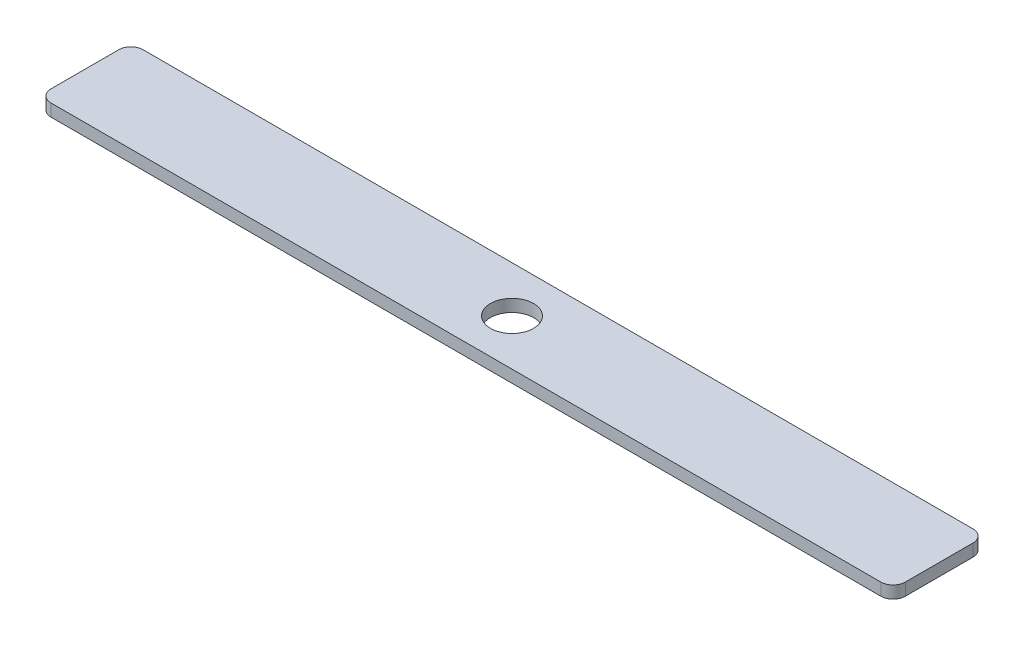
ISO-10303-21;
HEADER;
FILE_DESCRIPTION(('STEP AP214'),'2;1');
FILE_NAME('part.step','',(''),(''),'','','');
FILE_SCHEMA(('AUTOMOTIVE_DESIGN { 1 0 10303 214 1 1 1 1 }'));
ENDSEC;
DATA;
#1=APPLICATION_CONTEXT('core data for automotive mechanical design processes');
#2=APPLICATION_PROTOCOL_DEFINITION('international standard','automotive_design',2000,#1);
#3=PRODUCT_CONTEXT('',#1,'mechanical');
#4=PRODUCT('Part','Part','',(#3));
#5=PRODUCT_RELATED_PRODUCT_CATEGORY('part','',(#4));
#6=PRODUCT_DEFINITION_FORMATION('','',#4);
#7=PRODUCT_DEFINITION_CONTEXT('part definition',#1,'design');
#8=PRODUCT_DEFINITION('design','',#6,#7);
#9=PRODUCT_DEFINITION_SHAPE('','',#8);
#10=(LENGTH_UNIT() NAMED_UNIT(*) SI_UNIT(.MILLI.,.METRE.));
#11=(NAMED_UNIT(*) PLANE_ANGLE_UNIT() SI_UNIT($,.RADIAN.));
#12=(NAMED_UNIT(*) SI_UNIT($,.STERADIAN.) SOLID_ANGLE_UNIT());
#13=UNCERTAINTY_MEASURE_WITH_UNIT(LENGTH_MEASURE(1.E-05),#10,'distance_accuracy_value','');
#14=(GEOMETRIC_REPRESENTATION_CONTEXT(3) GLOBAL_UNCERTAINTY_ASSIGNED_CONTEXT((#13)) GLOBAL_UNIT_ASSIGNED_CONTEXT((#10,
#11,#12)) REPRESENTATION_CONTEXT('',''));
#15=CARTESIAN_POINT('',(0.,0.,0.));
#16=DIRECTION('',(0.,0.,1.));
#17=DIRECTION('',(1.,0.,0.));
#18=AXIS2_PLACEMENT_3D('',#15,#16,#17);
#19=CARTESIAN_POINT('',(-176.5935,-5.08,19.05));
#20=DIRECTION('',(-1.,0.,0.));
#21=DIRECTION('',(0.,0.,1.));
#22=AXIS2_PLACEMENT_3D('',#19,#20,#21);
#23=PLANE('',#22);
#24=DIRECTION('',(0.,0.,1.));
#25=VECTOR('',#24,1.);
#26=CARTESIAN_POINT('',(-176.5935,0.,19.05));
#27=LINE('',#26,#25);
#28=CARTESIAN_POINT('',(-176.5935,0.,-13.97));
#29=VERTEX_POINT('',#28);
#30=CARTESIAN_POINT('',(-176.5935,0.,13.97));
#31=VERTEX_POINT('',#30);
#32=EDGE_CURVE('E180',#29,#31,#27,.T.);
#33=ORIENTED_EDGE('',*,*,#32,.F.);
#34=DIRECTION('',(0.,1.,0.));
#35=VECTOR('',#34,1.);
#36=CARTESIAN_POINT('',(-176.5935,-5.08,-13.97));
#37=LINE('',#36,#35);
#38=CARTESIAN_POINT('',(-176.5935,-5.08,-13.97));
#39=VERTEX_POINT('',#38);
#40=EDGE_CURVE('E11',#29,#39,#37,.F.);
#41=ORIENTED_EDGE('',*,*,#40,.T.);
#42=DIRECTION('',(0.,0.,1.));
#43=VECTOR('',#42,1.);
#44=CARTESIAN_POINT('',(-176.5935,-5.08,19.05));
#45=LINE('',#44,#43);
#46=CARTESIAN_POINT('',(-176.5935,-5.08,13.97));
#47=VERTEX_POINT('',#46);
#48=EDGE_CURVE('E183',#39,#47,#45,.T.);
#49=ORIENTED_EDGE('',*,*,#48,.T.);
#50=DIRECTION('',(0.,1.,0.));
#51=VECTOR('',#50,1.);
#52=CARTESIAN_POINT('',(-176.5935,-5.08,13.97));
#53=LINE('',#52,#51);
#54=EDGE_CURVE('E51',#47,#31,#53,.T.);
#55=ORIENTED_EDGE('',*,*,#54,.T.);
#56=EDGE_LOOP('',(#33,#41,#49,#55));
#57=FACE_BOUND('',#56,.T.);
#58=ADVANCED_FACE('F42',(#57),#23,.T.);
#59=CARTESIAN_POINT('',(176.5935,-5.08,-19.05));
#60=DIRECTION('',(0.,0.,-1.));
#61=DIRECTION('',(-1.,0.,0.));
#62=AXIS2_PLACEMENT_3D('',#59,#60,#61);
#63=PLANE('',#62);
#64=DIRECTION('',(-1.,0.,0.));
#65=VECTOR('',#64,1.);
#66=CARTESIAN_POINT('',(176.5935,0.,-19.05));
#67=LINE('',#66,#65);
#68=CARTESIAN_POINT('',(171.5135,0.,-19.05));
#69=VERTEX_POINT('',#68);
#70=CARTESIAN_POINT('',(-171.5135,0.,-19.05));
#71=VERTEX_POINT('',#70);
#72=EDGE_CURVE('E130',#69,#71,#67,.T.);
#73=ORIENTED_EDGE('',*,*,#72,.F.);
#74=DIRECTION('',(0.,1.,0.));
#75=VECTOR('',#74,1.);
#76=CARTESIAN_POINT('',(171.5135,-5.08,-19.05));
#77=LINE('',#76,#75);
#78=CARTESIAN_POINT('',(171.5135,-5.08,-19.05));
#79=VERTEX_POINT('',#78);
#80=EDGE_CURVE('E155',#69,#79,#77,.F.);
#81=ORIENTED_EDGE('',*,*,#80,.T.);
#82=DIRECTION('',(-1.,0.,0.));
#83=VECTOR('',#82,1.);
#84=CARTESIAN_POINT('',(176.5935,-5.08,-19.05));
#85=LINE('',#84,#83);
#86=CARTESIAN_POINT('',(-171.5135,-5.08,-19.05));
#87=VERTEX_POINT('',#86);
#88=EDGE_CURVE('E134',#79,#87,#85,.T.);
#89=ORIENTED_EDGE('',*,*,#88,.T.);
#90=DIRECTION('',(0.,1.,0.));
#91=VECTOR('',#90,1.);
#92=CARTESIAN_POINT('',(-171.5135,-5.08,-19.05));
#93=LINE('',#92,#91);
#94=EDGE_CURVE('E151',#87,#71,#93,.T.);
#95=ORIENTED_EDGE('',*,*,#94,.T.);
#96=EDGE_LOOP('',(#73,#81,#89,#95));
#97=FACE_BOUND('',#96,.T.);
#98=ADVANCED_FACE('F225',(#97),#63,.T.);
#99=CARTESIAN_POINT('',(176.5935,-5.08,19.05));
#100=DIRECTION('',(1.,0.,0.));
#101=DIRECTION('',(0.,0.,-1.));
#102=AXIS2_PLACEMENT_3D('',#99,#100,#101);
#103=PLANE('',#102);
#104=DIRECTION('',(0.,0.,-1.));
#105=VECTOR('',#104,1.);
#106=CARTESIAN_POINT('',(176.5935,-5.08,19.05));
#107=LINE('',#106,#105);
#108=CARTESIAN_POINT('',(176.5935,-5.08,13.97));
#109=VERTEX_POINT('',#108);
#110=CARTESIAN_POINT('',(176.5935,-5.08,-13.97));
#111=VERTEX_POINT('',#110);
#112=EDGE_CURVE('E141',#109,#111,#107,.T.);
#113=ORIENTED_EDGE('',*,*,#112,.T.);
#114=DIRECTION('',(0.,1.,0.));
#115=VECTOR('',#114,1.);
#116=CARTESIAN_POINT('',(176.5935,-5.08,-13.97));
#117=LINE('',#116,#115);
#118=CARTESIAN_POINT('',(176.5935,0.,-13.97));
#119=VERTEX_POINT('',#118);
#120=EDGE_CURVE('E128',#111,#119,#117,.T.);
#121=ORIENTED_EDGE('',*,*,#120,.T.);
#122=DIRECTION('',(0.,0.,-1.));
#123=VECTOR('',#122,1.);
#124=CARTESIAN_POINT('',(176.5935,0.,19.05));
#125=LINE('',#124,#123);
#126=CARTESIAN_POINT('',(176.5935,0.,13.97));
#127=VERTEX_POINT('',#126);
#128=EDGE_CURVE('E112',#127,#119,#125,.T.);
#129=ORIENTED_EDGE('',*,*,#128,.F.);
#130=DIRECTION('',(0.,1.,0.));
#131=VECTOR('',#130,1.);
#132=CARTESIAN_POINT('',(176.5935,-5.08,13.97));
#133=LINE('',#132,#131);
#134=EDGE_CURVE('E126',#127,#109,#133,.F.);
#135=ORIENTED_EDGE('',*,*,#134,.T.);
#136=EDGE_LOOP('',(#113,#121,#129,#135));
#137=FACE_BOUND('',#136,.T.);
#138=ADVANCED_FACE('F125',(#137),#103,.T.);
#139=CARTESIAN_POINT('',(176.5935,-5.08,19.05));
#140=DIRECTION('',(0.,0.,1.));
#141=DIRECTION('',(1.,0.,0.));
#142=AXIS2_PLACEMENT_3D('',#139,#140,#141);
#143=PLANE('',#142);
#144=DIRECTION('',(1.,0.,0.));
#145=VECTOR('',#144,1.);
#146=CARTESIAN_POINT('',(176.5935,-5.08,19.05));
#147=LINE('',#146,#145);
#148=CARTESIAN_POINT('',(-171.5135,-5.08,19.05));
#149=VERTEX_POINT('',#148);
#150=CARTESIAN_POINT('',(171.5135,-5.08,19.05));
#151=VERTEX_POINT('',#150);
#152=EDGE_CURVE('E199',#149,#151,#147,.T.);
#153=ORIENTED_EDGE('',*,*,#152,.T.);
#154=DIRECTION('',(0.,1.,0.));
#155=VECTOR('',#154,1.);
#156=CARTESIAN_POINT('',(171.5135,-5.08,19.05));
#157=LINE('',#156,#155);
#158=CARTESIAN_POINT('',(171.5135,0.,19.05));
#159=VERTEX_POINT('',#158);
#160=EDGE_CURVE('E171',#151,#159,#157,.T.);
#161=ORIENTED_EDGE('',*,*,#160,.T.);
#162=DIRECTION('',(1.,0.,0.));
#163=VECTOR('',#162,1.);
#164=CARTESIAN_POINT('',(176.5935,0.,19.05));
#165=LINE('',#164,#163);
#166=CARTESIAN_POINT('',(-171.5135,0.,19.05));
#167=VERTEX_POINT('',#166);
#168=EDGE_CURVE('E113',#167,#159,#165,.T.);
#169=ORIENTED_EDGE('',*,*,#168,.F.);
#170=DIRECTION('',(0.,1.,0.));
#171=VECTOR('',#170,1.);
#172=CARTESIAN_POINT('',(-171.5135,-5.08,19.05));
#173=LINE('',#172,#171);
#174=EDGE_CURVE('E65',#167,#149,#173,.F.);
#175=ORIENTED_EDGE('',*,*,#174,.T.);
#176=EDGE_LOOP('',(#153,#161,#169,#175));
#177=FACE_BOUND('',#176,.T.);
#178=ADVANCED_FACE('F220',(#177),#143,.T.);
#179=CARTESIAN_POINT('',(0.,-5.08,0.));
#180=DIRECTION('',(0.,1.,0.));
#181=DIRECTION('',(0.,0.,1.));
#182=AXIS2_PLACEMENT_3D('',#179,#180,#181);
#183=PLANE('',#182);
#184=CARTESIAN_POINT('',(0.,-5.08,0.));
#185=DIRECTION('',(0.,1.,0.));
#186=DIRECTION('',(0.,0.,1.));
#187=AXIS2_PLACEMENT_3D('',#184,#185,#186);
#188=CIRCLE('',#187,8.91162430098558);
#189=CARTESIAN_POINT('',(0.,-5.08,8.91162430098558));
#190=VERTEX_POINT('',#189);
#191=EDGE_CURVE('E188',#190,#190,#188,.T.);
#192=ORIENTED_EDGE('',*,*,#191,.T.);
#193=EDGE_LOOP('',(#192));
#194=FACE_BOUND('',#193,.T.);
#195=ORIENTED_EDGE('',*,*,#88,.F.);
#196=CARTESIAN_POINT('',(171.5135,-5.08,-13.97));
#197=DIRECTION('',(0.,1.,0.));
#198=DIRECTION('',(0.,0.,1.));
#199=AXIS2_PLACEMENT_3D('',#196,#197,#198);
#200=CIRCLE('',#199,5.08);
#201=EDGE_CURVE('E166',#79,#111,#200,.F.);
#202=ORIENTED_EDGE('',*,*,#201,.T.);
#203=ORIENTED_EDGE('',*,*,#112,.F.);
#204=CARTESIAN_POINT('',(171.5135,-5.08,13.97));
#205=DIRECTION('',(0.,1.,0.));
#206=DIRECTION('',(0.,0.,1.));
#207=AXIS2_PLACEMENT_3D('',#204,#205,#206);
#208=CIRCLE('',#207,5.08);
#209=EDGE_CURVE('E58',#109,#151,#208,.F.);
#210=ORIENTED_EDGE('',*,*,#209,.T.);
#211=ORIENTED_EDGE('',*,*,#152,.F.);
#212=CARTESIAN_POINT('',(-171.5135,-5.08,13.97));
#213=DIRECTION('',(0.,1.,0.));
#214=DIRECTION('',(0.,0.,1.));
#215=AXIS2_PLACEMENT_3D('',#212,#213,#214);
#216=CIRCLE('',#215,5.08);
#217=EDGE_CURVE('E158',#149,#47,#216,.F.);
#218=ORIENTED_EDGE('',*,*,#217,.T.);
#219=ORIENTED_EDGE('',*,*,#48,.F.);
#220=CARTESIAN_POINT('',(-171.5135,-5.08,-13.97));
#221=DIRECTION('',(0.,1.,0.));
#222=DIRECTION('',(0.,0.,1.));
#223=AXIS2_PLACEMENT_3D('',#220,#221,#222);
#224=CIRCLE('',#223,5.08);
#225=EDGE_CURVE('E161',#39,#87,#224,.F.);
#226=ORIENTED_EDGE('',*,*,#225,.T.);
#227=EDGE_LOOP('',(#195,#202,#203,#210,#211,#218,#219,#226));
#228=FACE_BOUND('',#227,.T.);
#229=ADVANCED_FACE('F211',(#194,#228),#183,.F.);
#230=CARTESIAN_POINT('',(0.,0.,0.));
#231=DIRECTION('',(0.,1.,0.));
#232=DIRECTION('',(0.,0.,1.));
#233=AXIS2_PLACEMENT_3D('',#230,#231,#232);
#234=PLANE('',#233);
#235=CARTESIAN_POINT('',(0.,0.,0.));
#236=DIRECTION('',(0.,1.,0.));
#237=DIRECTION('',(0.,0.,1.));
#238=AXIS2_PLACEMENT_3D('',#235,#236,#237);
#239=CIRCLE('',#238,8.91162430098558);
#240=CARTESIAN_POINT('',(0.,0.,8.91162430098558));
#241=VERTEX_POINT('',#240);
#242=EDGE_CURVE('E194',#241,#241,#239,.T.);
#243=ORIENTED_EDGE('',*,*,#242,.F.);
#244=EDGE_LOOP('',(#243));
#245=FACE_BOUND('',#244,.T.);
#246=ORIENTED_EDGE('',*,*,#128,.T.);
#247=CARTESIAN_POINT('',(171.5135,0.,-13.97));
#248=DIRECTION('',(0.,1.,0.));
#249=DIRECTION('',(0.,0.,1.));
#250=AXIS2_PLACEMENT_3D('',#247,#248,#249);
#251=CIRCLE('',#250,5.08);
#252=EDGE_CURVE('E119',#119,#69,#251,.T.);
#253=ORIENTED_EDGE('',*,*,#252,.T.);
#254=ORIENTED_EDGE('',*,*,#72,.T.);
#255=CARTESIAN_POINT('',(-171.5135,0.,-13.97));
#256=DIRECTION('',(0.,1.,0.));
#257=DIRECTION('',(0.,0.,1.));
#258=AXIS2_PLACEMENT_3D('',#255,#256,#257);
#259=CIRCLE('',#258,5.08);
#260=EDGE_CURVE('E120',#71,#29,#259,.T.);
#261=ORIENTED_EDGE('',*,*,#260,.T.);
#262=ORIENTED_EDGE('',*,*,#32,.T.);
#263=CARTESIAN_POINT('',(-171.5135,0.,13.97));
#264=DIRECTION('',(0.,1.,0.));
#265=DIRECTION('',(0.,0.,1.));
#266=AXIS2_PLACEMENT_3D('',#263,#264,#265);
#267=CIRCLE('',#266,5.08);
#268=EDGE_CURVE('E138',#31,#167,#267,.T.);
#269=ORIENTED_EDGE('',*,*,#268,.T.);
#270=ORIENTED_EDGE('',*,*,#168,.T.);
#271=CARTESIAN_POINT('',(171.5135,0.,13.97));
#272=DIRECTION('',(0.,1.,0.));
#273=DIRECTION('',(0.,0.,1.));
#274=AXIS2_PLACEMENT_3D('',#271,#272,#273);
#275=CIRCLE('',#274,5.08);
#276=EDGE_CURVE('E109',#159,#127,#275,.T.);
#277=ORIENTED_EDGE('',*,*,#276,.T.);
#278=EDGE_LOOP('',(#246,#253,#254,#261,#262,#269,#270,#277));
#279=FACE_BOUND('',#278,.T.);
#280=ADVANCED_FACE('F111',(#245,#279),#234,.T.);
#281=CARTESIAN_POINT('',(0.,-5.08,0.));
#282=DIRECTION('',(0.,1.,0.));
#283=DIRECTION('',(0.,0.,1.));
#284=AXIS2_PLACEMENT_3D('',#281,#282,#283);
#285=CYLINDRICAL_SURFACE('',#284,8.91162430098558);
#286=ORIENTED_EDGE('',*,*,#191,.F.);
#287=EDGE_LOOP('',(#286));
#288=FACE_BOUND('',#287,.T.);
#289=ORIENTED_EDGE('',*,*,#242,.T.);
#290=EDGE_LOOP('',(#289));
#291=FACE_BOUND('',#290,.T.);
#292=ADVANCED_FACE('F208',(#288,#291),#285,.F.);
#293=CARTESIAN_POINT('',(171.5135,-5.08,-13.97));
#294=DIRECTION('',(0.,1.,0.));
#295=DIRECTION('',(0.,0.,1.));
#296=AXIS2_PLACEMENT_3D('',#293,#294,#295);
#297=CYLINDRICAL_SURFACE('',#296,5.08);
#298=ORIENTED_EDGE('',*,*,#201,.F.);
#299=ORIENTED_EDGE('',*,*,#80,.F.);
#300=ORIENTED_EDGE('',*,*,#252,.F.);
#301=ORIENTED_EDGE('',*,*,#120,.F.);
#302=EDGE_LOOP('',(#298,#299,#300,#301));
#303=FACE_BOUND('',#302,.T.);
#304=ADVANCED_FACE('F217',(#303),#297,.T.);
#305=CARTESIAN_POINT('',(171.5135,-5.08,13.97));
#306=DIRECTION('',(0.,1.,0.));
#307=DIRECTION('',(0.,0.,1.));
#308=AXIS2_PLACEMENT_3D('',#305,#306,#307);
#309=CYLINDRICAL_SURFACE('',#308,5.08);
#310=ORIENTED_EDGE('',*,*,#209,.F.);
#311=ORIENTED_EDGE('',*,*,#134,.F.);
#312=ORIENTED_EDGE('',*,*,#276,.F.);
#313=ORIENTED_EDGE('',*,*,#160,.F.);
#314=EDGE_LOOP('',(#310,#311,#312,#313));
#315=FACE_BOUND('',#314,.T.);
#316=ADVANCED_FACE('F132',(#315),#309,.T.);
#317=CARTESIAN_POINT('',(-171.5135,-5.08,-13.97));
#318=DIRECTION('',(0.,1.,0.));
#319=DIRECTION('',(0.,0.,1.));
#320=AXIS2_PLACEMENT_3D('',#317,#318,#319);
#321=CYLINDRICAL_SURFACE('',#320,5.08);
#322=ORIENTED_EDGE('',*,*,#225,.F.);
#323=ORIENTED_EDGE('',*,*,#40,.F.);
#324=ORIENTED_EDGE('',*,*,#260,.F.);
#325=ORIENTED_EDGE('',*,*,#94,.F.);
#326=EDGE_LOOP('',(#322,#323,#324,#325));
#327=FACE_BOUND('',#326,.T.);
#328=ADVANCED_FACE('F238',(#327),#321,.T.);
#329=CARTESIAN_POINT('',(-171.5135,-5.08,13.97));
#330=DIRECTION('',(0.,1.,0.));
#331=DIRECTION('',(0.,0.,1.));
#332=AXIS2_PLACEMENT_3D('',#329,#330,#331);
#333=CYLINDRICAL_SURFACE('',#332,5.08);
#334=ORIENTED_EDGE('',*,*,#217,.F.);
#335=ORIENTED_EDGE('',*,*,#174,.F.);
#336=ORIENTED_EDGE('',*,*,#268,.F.);
#337=ORIENTED_EDGE('',*,*,#54,.F.);
#338=EDGE_LOOP('',(#334,#335,#336,#337));
#339=FACE_BOUND('',#338,.T.);
#340=ADVANCED_FACE('F44',(#339),#333,.T.);
#341=CLOSED_SHELL('',(#58,#98,#138,#178,#229,#280,#292,#304,#316,#328,#340));
#342=MANIFOLD_SOLID_BREP('B2',#341);
#343=ADVANCED_BREP_SHAPE_REPRESENTATION('',(#18,#342),#14);
#344=SHAPE_DEFINITION_REPRESENTATION(#9,#343);
ENDSEC;
END-ISO-10303-21;
